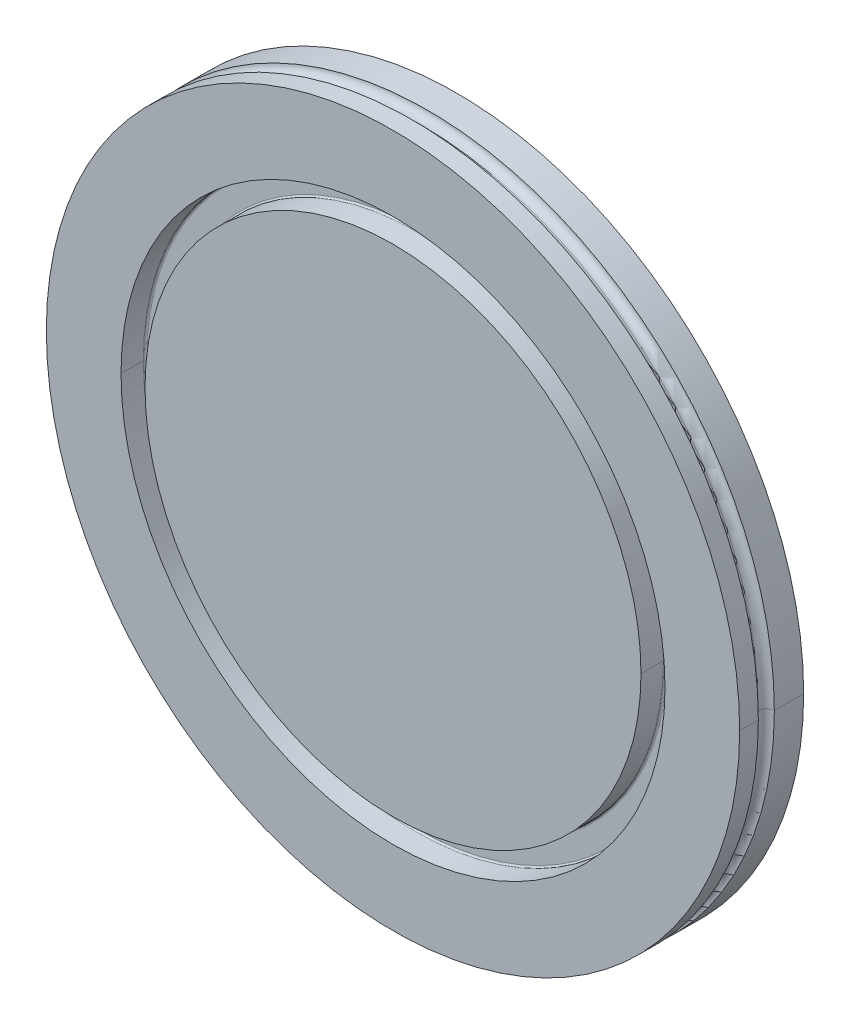
ISO-10303-21;
HEADER;
FILE_DESCRIPTION(('STEP AP214'),'2;1');
FILE_NAME('part.step','',(''),(''),'','','');
FILE_SCHEMA(('AUTOMOTIVE_DESIGN { 1 0 10303 214 1 1 1 1 }'));
ENDSEC;
DATA;
#1=APPLICATION_CONTEXT('core data for automotive mechanical design processes');
#2=APPLICATION_PROTOCOL_DEFINITION('international standard','automotive_design',2000,#1);
#3=PRODUCT_CONTEXT('',#1,'mechanical');
#4=PRODUCT('Part','Part','',(#3));
#5=PRODUCT_RELATED_PRODUCT_CATEGORY('part','',(#4));
#6=PRODUCT_DEFINITION_FORMATION('','',#4);
#7=PRODUCT_DEFINITION_CONTEXT('part definition',#1,'design');
#8=PRODUCT_DEFINITION('design','',#6,#7);
#9=PRODUCT_DEFINITION_SHAPE('','',#8);
#10=(LENGTH_UNIT() NAMED_UNIT(*) SI_UNIT(.MILLI.,.METRE.));
#11=(NAMED_UNIT(*) PLANE_ANGLE_UNIT() SI_UNIT($,.RADIAN.));
#12=(NAMED_UNIT(*) SI_UNIT($,.STERADIAN.) SOLID_ANGLE_UNIT());
#13=UNCERTAINTY_MEASURE_WITH_UNIT(LENGTH_MEASURE(1.E-05),#10,'distance_accuracy_value','');
#14=(GEOMETRIC_REPRESENTATION_CONTEXT(3) GLOBAL_UNCERTAINTY_ASSIGNED_CONTEXT((#13)) GLOBAL_UNIT_ASSIGNED_CONTEXT((#10,
#11,#12)) REPRESENTATION_CONTEXT('',''));
#15=CARTESIAN_POINT('',(0.,0.,0.));
#16=DIRECTION('',(0.,0.,1.));
#17=DIRECTION('',(1.,0.,0.));
#18=AXIS2_PLACEMENT_3D('',#15,#16,#17);
#19=CARTESIAN_POINT('',(0.,0.,0.));
#20=DIRECTION('',(0.,0.,-1.));
#21=DIRECTION('',(0.,-1.,0.));
#22=AXIS2_PLACEMENT_3D('',#19,#20,#21);
#23=PLANE('',#22);
#24=CARTESIAN_POINT('',(0.,0.,0.));
#25=DIRECTION('',(0.,0.,1.));
#26=DIRECTION('',(1.,0.,0.));
#27=AXIS2_PLACEMENT_3D('',#24,#25,#26);
#28=CIRCLE('',#27,46.5);
#29=CARTESIAN_POINT('',(46.5,0.,0.));
#30=VERTEX_POINT('',#29);
#31=CARTESIAN_POINT('',(-46.5,0.,0.));
#32=VERTEX_POINT('',#31);
#33=EDGE_CURVE('E212',#30,#32,#28,.T.);
#34=ORIENTED_EDGE('',*,*,#33,.T.);
#35=CARTESIAN_POINT('',(0.,0.,0.));
#36=DIRECTION('',(0.,0.,1.));
#37=DIRECTION('',(1.,0.,0.));
#38=AXIS2_PLACEMENT_3D('',#35,#36,#37);
#39=CIRCLE('',#38,46.5);
#40=EDGE_CURVE('E11',#32,#30,#39,.T.);
#41=ORIENTED_EDGE('',*,*,#40,.T.);
#42=EDGE_LOOP('',(#34,#41));
#43=FACE_BOUND('',#42,.T.);
#44=ADVANCED_FACE('F17',(#43),#23,.F.);
#45=CARTESIAN_POINT('',(0.,0.,0.));
#46=DIRECTION('',(0.,0.,1.));
#47=DIRECTION('',(1.,0.,0.));
#48=AXIS2_PLACEMENT_3D('',#45,#46,#47);
#49=CYLINDRICAL_SURFACE('',#48,46.5);
#50=DIRECTION('',(0.,0.,1.));
#51=VECTOR('',#50,1.);
#52=CARTESIAN_POINT('',(-46.5,0.,0.));
#53=LINE('',#52,#51);
#54=CARTESIAN_POINT('',(-46.5,0.,-4.2));
#55=VERTEX_POINT('',#54);
#56=EDGE_CURVE('E210',#55,#32,#53,.T.);
#57=ORIENTED_EDGE('',*,*,#56,.F.);
#58=CARTESIAN_POINT('',(0.,0.,-4.2));
#59=DIRECTION('',(0.,0.,1.));
#60=DIRECTION('',(1.,0.,0.));
#61=AXIS2_PLACEMENT_3D('',#58,#59,#60);
#62=CIRCLE('',#61,46.5);
#63=CARTESIAN_POINT('',(46.5,0.,-4.2));
#64=VERTEX_POINT('',#63);
#65=EDGE_CURVE('E225',#55,#64,#62,.T.);
#66=ORIENTED_EDGE('',*,*,#65,.T.);
#67=DIRECTION('',(0.,0.,1.));
#68=VECTOR('',#67,1.);
#69=CARTESIAN_POINT('',(46.5,0.,0.));
#70=LINE('',#69,#68);
#71=EDGE_CURVE('E215',#64,#30,#70,.T.);
#72=ORIENTED_EDGE('',*,*,#71,.T.);
#73=ORIENTED_EDGE('',*,*,#40,.F.);
#74=EDGE_LOOP('',(#57,#66,#72,#73));
#75=FACE_BOUND('',#74,.T.);
#76=ADVANCED_FACE('F623',(#75),#49,.T.);
#77=CARTESIAN_POINT('',(0.,0.,-4.2));
#78=DIRECTION('',(0.,0.,1.));
#79=DIRECTION('',(1.,0.,0.));
#80=AXIS2_PLACEMENT_3D('',#77,#78,#79);
#81=TOROIDAL_SURFACE('',#80,46.8,0.3);
#82=CARTESIAN_POINT('',(-46.8,0.,-4.2));
#83=DIRECTION('',(0.,1.,0.));
#84=DIRECTION('',(-1.,0.,0.));
#85=AXIS2_PLACEMENT_3D('',#82,#83,#84);
#86=CIRCLE('',#85,0.3);
#87=CARTESIAN_POINT('',(-46.8,0.,-4.5));
#88=VERTEX_POINT('',#87);
#89=EDGE_CURVE('E220',#55,#88,#86,.T.);
#90=ORIENTED_EDGE('',*,*,#89,.F.);
#91=CARTESIAN_POINT('',(0.,0.,-4.2));
#92=DIRECTION('',(0.,0.,1.));
#93=DIRECTION('',(1.,0.,0.));
#94=AXIS2_PLACEMENT_3D('',#91,#92,#93);
#95=CIRCLE('',#94,46.5);
#96=EDGE_CURVE('E185',#64,#55,#95,.T.);
#97=ORIENTED_EDGE('',*,*,#96,.F.);
#98=CARTESIAN_POINT('',(46.8,0.,-4.2));
#99=DIRECTION('',(0.,-1.,0.));
#100=DIRECTION('',(0.,0.,-1.));
#101=AXIS2_PLACEMENT_3D('',#98,#99,#100);
#102=CIRCLE('',#101,0.3);
#103=CARTESIAN_POINT('',(46.8,0.,-4.5));
#104=VERTEX_POINT('',#103);
#105=EDGE_CURVE('E230',#64,#104,#102,.T.);
#106=ORIENTED_EDGE('',*,*,#105,.T.);
#107=CARTESIAN_POINT('',(0.,0.,-4.5));
#108=DIRECTION('',(0.,0.,1.));
#109=DIRECTION('',(1.,0.,0.));
#110=AXIS2_PLACEMENT_3D('',#107,#108,#109);
#111=CIRCLE('',#110,46.8);
#112=EDGE_CURVE('E28',#104,#88,#111,.T.);
#113=ORIENTED_EDGE('',*,*,#112,.T.);
#114=EDGE_LOOP('',(#90,#97,#106,#113));
#115=FACE_BOUND('',#114,.T.);
#116=ADVANCED_FACE('F627',(#115),#81,.F.);
#117=CARTESIAN_POINT('',(0.,50.7,-4.5));
#118=DIRECTION('',(0.,0.,-1.));
#119=DIRECTION('',(0.,-1.,0.));
#120=AXIS2_PLACEMENT_3D('',#117,#118,#119);
#121=PLANE('',#120);
#122=ORIENTED_EDGE('',*,*,#112,.F.);
#123=CARTESIAN_POINT('',(0.,0.,-4.5));
#124=DIRECTION('',(0.,0.,1.));
#125=DIRECTION('',(1.,0.,0.));
#126=AXIS2_PLACEMENT_3D('',#123,#124,#125);
#127=CIRCLE('',#126,46.8);
#128=EDGE_CURVE('E224',#88,#104,#127,.T.);
#129=ORIENTED_EDGE('',*,*,#128,.F.);
#130=EDGE_LOOP('',(#122,#129));
#131=FACE_BOUND('',#130,.T.);
#132=CARTESIAN_POINT('',(0.,0.,-4.5));
#133=DIRECTION('',(0.,0.,1.));
#134=DIRECTION('',(1.,0.,0.));
#135=AXIS2_PLACEMENT_3D('',#132,#133,#134);
#136=CIRCLE('',#135,50.7);
#137=CARTESIAN_POINT('',(50.7,0.,-4.5));
#138=VERTEX_POINT('',#137);
#139=CARTESIAN_POINT('',(-50.7,0.,-4.5));
#140=VERTEX_POINT('',#139);
#141=EDGE_CURVE('E112',#138,#140,#136,.T.);
#142=ORIENTED_EDGE('',*,*,#141,.T.);
#143=CARTESIAN_POINT('',(0.,0.,-4.5));
#144=DIRECTION('',(0.,0.,1.));
#145=DIRECTION('',(1.,0.,0.));
#146=AXIS2_PLACEMENT_3D('',#143,#144,#145);
#147=CIRCLE('',#146,50.7);
#148=EDGE_CURVE('E226',#140,#138,#147,.T.);
#149=ORIENTED_EDGE('',*,*,#148,.T.);
#150=EDGE_LOOP('',(#142,#149));
#151=FACE_BOUND('',#150,.T.);
#152=ADVANCED_FACE('F644',(#131,#151),#121,.F.);
#153=CARTESIAN_POINT('',(0.,0.,-4.2));
#154=DIRECTION('',(0.,0.,1.));
#155=DIRECTION('',(1.,0.,0.));
#156=AXIS2_PLACEMENT_3D('',#153,#154,#155);
#157=TOROIDAL_SURFACE('',#156,50.7,0.3);
#158=CARTESIAN_POINT('',(-50.7,0.,-4.2));
#159=DIRECTION('',(0.,1.,0.));
#160=DIRECTION('',(-1.,0.,0.));
#161=AXIS2_PLACEMENT_3D('',#158,#159,#160);
#162=CIRCLE('',#161,0.3);
#163=CARTESIAN_POINT('',(-51.,0.,-4.2));
#164=VERTEX_POINT('',#163);
#165=EDGE_CURVE('E229',#140,#164,#162,.T.);
#166=ORIENTED_EDGE('',*,*,#165,.F.);
#167=ORIENTED_EDGE('',*,*,#141,.F.);
#168=CARTESIAN_POINT('',(50.7,0.,-4.2));
#169=DIRECTION('',(0.,-1.,0.));
#170=DIRECTION('',(0.,0.,-1.));
#171=AXIS2_PLACEMENT_3D('',#168,#169,#170);
#172=CIRCLE('',#171,0.3);
#173=CARTESIAN_POINT('',(51.,0.,-4.2));
#174=VERTEX_POINT('',#173);
#175=EDGE_CURVE('E254',#138,#174,#172,.T.);
#176=ORIENTED_EDGE('',*,*,#175,.T.);
#177=CARTESIAN_POINT('',(0.,0.,-4.2));
#178=DIRECTION('',(0.,0.,1.));
#179=DIRECTION('',(1.,0.,0.));
#180=AXIS2_PLACEMENT_3D('',#177,#178,#179);
#181=CIRCLE('',#180,51.);
#182=EDGE_CURVE('E267',#174,#164,#181,.T.);
#183=ORIENTED_EDGE('',*,*,#182,.T.);
#184=EDGE_LOOP('',(#166,#167,#176,#183));
#185=FACE_BOUND('',#184,.T.);
#186=ADVANCED_FACE('F586',(#185),#157,.F.);
#187=CARTESIAN_POINT('',(0.,0.,0.));
#188=DIRECTION('',(0.,0.,1.));
#189=DIRECTION('',(1.,0.,0.));
#190=AXIS2_PLACEMENT_3D('',#187,#188,#189);
#191=CYLINDRICAL_SURFACE('',#190,51.);
#192=DIRECTION('',(0.,0.,1.));
#193=VECTOR('',#192,1.);
#194=CARTESIAN_POINT('',(-51.,0.,0.));
#195=LINE('',#194,#193);
#196=CARTESIAN_POINT('',(-51.,0.,0.));
#197=VERTEX_POINT('',#196);
#198=EDGE_CURVE('E235',#164,#197,#195,.T.);
#199=ORIENTED_EDGE('',*,*,#198,.F.);
#200=ORIENTED_EDGE('',*,*,#182,.F.);
#201=DIRECTION('',(0.,0.,1.));
#202=VECTOR('',#201,1.);
#203=CARTESIAN_POINT('',(51.,0.,0.));
#204=LINE('',#203,#202);
#205=CARTESIAN_POINT('',(51.,0.,0.));
#206=VERTEX_POINT('',#205);
#207=EDGE_CURVE('E21',#174,#206,#204,.T.);
#208=ORIENTED_EDGE('',*,*,#207,.T.);
#209=CARTESIAN_POINT('',(0.,0.,0.));
#210=DIRECTION('',(0.,0.,1.));
#211=DIRECTION('',(1.,0.,0.));
#212=AXIS2_PLACEMENT_3D('',#209,#210,#211);
#213=CIRCLE('',#212,51.);
#214=EDGE_CURVE('E265',#206,#197,#213,.T.);
#215=ORIENTED_EDGE('',*,*,#214,.T.);
#216=EDGE_LOOP('',(#199,#200,#208,#215));
#217=FACE_BOUND('',#216,.T.);
#218=ADVANCED_FACE('F581',(#217),#191,.F.);
#219=CARTESIAN_POINT('',(0.,51.,0.));
#220=DIRECTION('',(0.,0.,-1.));
#221=DIRECTION('',(0.,-1.,0.));
#222=AXIS2_PLACEMENT_3D('',#219,#220,#221);
#223=PLANE('',#222);
#224=ORIENTED_EDGE('',*,*,#214,.F.);
#225=CARTESIAN_POINT('',(0.,0.,0.));
#226=DIRECTION('',(0.,0.,1.));
#227=DIRECTION('',(1.,0.,0.));
#228=AXIS2_PLACEMENT_3D('',#225,#226,#227);
#229=CIRCLE('',#228,51.);
#230=EDGE_CURVE('E231',#197,#206,#229,.T.);
#231=ORIENTED_EDGE('',*,*,#230,.F.);
#232=EDGE_LOOP('',(#224,#231));
#233=FACE_BOUND('',#232,.T.);
#234=CARTESIAN_POINT('',(0.,0.,0.));
#235=DIRECTION('',(0.,0.,1.));
#236=DIRECTION('',(1.,0.,0.));
#237=AXIS2_PLACEMENT_3D('',#234,#235,#236);
#238=CIRCLE('',#237,65.);
#239=CARTESIAN_POINT('',(65.,0.,0.));
#240=VERTEX_POINT('',#239);
#241=CARTESIAN_POINT('',(-65.,0.,0.));
#242=VERTEX_POINT('',#241);
#243=EDGE_CURVE('E172',#240,#242,#238,.T.);
#244=ORIENTED_EDGE('',*,*,#243,.T.);
#245=CARTESIAN_POINT('',(0.,0.,0.));
#246=DIRECTION('',(0.,0.,1.));
#247=DIRECTION('',(1.,0.,0.));
#248=AXIS2_PLACEMENT_3D('',#245,#246,#247);
#249=CIRCLE('',#248,65.);
#250=EDGE_CURVE('E268',#242,#240,#249,.T.);
#251=ORIENTED_EDGE('',*,*,#250,.T.);
#252=EDGE_LOOP('',(#244,#251));
#253=FACE_BOUND('',#252,.T.);
#254=ADVANCED_FACE('F585',(#233,#253),#223,.F.);
#255=CARTESIAN_POINT('',(0.,0.,0.));
#256=DIRECTION('',(0.,0.,1.));
#257=DIRECTION('',(1.,0.,0.));
#258=AXIS2_PLACEMENT_3D('',#255,#256,#257);
#259=CYLINDRICAL_SURFACE('',#258,65.);
#260=DIRECTION('',(0.,0.,1.));
#261=VECTOR('',#260,1.);
#262=CARTESIAN_POINT('',(-65.,0.,0.));
#263=LINE('',#262,#261);
#264=CARTESIAN_POINT('',(-65.,0.,-3.5));
#265=VERTEX_POINT('',#264);
#266=EDGE_CURVE('E180',#265,#242,#263,.T.);
#267=ORIENTED_EDGE('',*,*,#266,.F.);
#268=CARTESIAN_POINT('',(0.,0.,-3.5));
#269=DIRECTION('',(0.,0.,1.));
#270=DIRECTION('',(1.,0.,0.));
#271=AXIS2_PLACEMENT_3D('',#268,#269,#270);
#272=CIRCLE('',#271,65.);
#273=CARTESIAN_POINT('',(65.,0.,-3.5));
#274=VERTEX_POINT('',#273);
#275=EDGE_CURVE('E178',#265,#274,#272,.T.);
#276=ORIENTED_EDGE('',*,*,#275,.T.);
#277=DIRECTION('',(0.,0.,1.));
#278=VECTOR('',#277,1.);
#279=CARTESIAN_POINT('',(65.,0.,0.));
#280=LINE('',#279,#278);
#281=EDGE_CURVE('E164',#274,#240,#280,.T.);
#282=ORIENTED_EDGE('',*,*,#281,.T.);
#283=ORIENTED_EDGE('',*,*,#250,.F.);
#284=EDGE_LOOP('',(#267,#276,#282,#283));
#285=FACE_BOUND('',#284,.T.);
#286=ADVANCED_FACE('F179',(#285),#259,.T.);
#287=CARTESIAN_POINT('',(0.,0.,-5.));
#288=DIRECTION('',(0.,0.,1.));
#289=DIRECTION('',(1.,0.,0.));
#290=AXIS2_PLACEMENT_3D('',#287,#288,#289);
#291=TOROIDAL_SURFACE('',#290,65.,1.5);
#292=CARTESIAN_POINT('',(0.,0.,-5.));
#293=DIRECTION('',(0.,0.,1.));
#294=DIRECTION('',(1.,0.,0.));
#295=AXIS2_PLACEMENT_3D('',#292,#293,#294);
#296=CIRCLE('',#295,63.5);
#297=CARTESIAN_POINT('',(63.5,0.,-5.));
#298=VERTEX_POINT('',#297);
#299=CARTESIAN_POINT('',(-63.5,0.,-5.));
#300=VERTEX_POINT('',#299);
#301=EDGE_CURVE('E201',#298,#300,#296,.T.);
#302=ORIENTED_EDGE('',*,*,#301,.F.);
#303=CARTESIAN_POINT('',(65.,0.,-5.));
#304=DIRECTION('',(0.,-1.,0.));
#305=DIRECTION('',(0.,0.,-1.));
#306=AXIS2_PLACEMENT_3D('',#303,#304,#305);
#307=CIRCLE('',#306,1.5);
#308=CARTESIAN_POINT('',(65.,0.,-6.5));
#309=VERTEX_POINT('',#308);
#310=EDGE_CURVE('E240',#298,#309,#307,.T.);
#311=ORIENTED_EDGE('',*,*,#310,.T.);
#312=CARTESIAN_POINT('',(0.,0.,-6.5));
#313=DIRECTION('',(0.,0.,1.));
#314=DIRECTION('',(1.,0.,0.));
#315=AXIS2_PLACEMENT_3D('',#312,#313,#314);
#316=CIRCLE('',#315,65.);
#317=CARTESIAN_POINT('',(-65.,0.,-6.5));
#318=VERTEX_POINT('',#317);
#319=EDGE_CURVE('E250',#309,#318,#316,.T.);
#320=ORIENTED_EDGE('',*,*,#319,.T.);
#321=CARTESIAN_POINT('',(-65.,0.,-5.));
#322=DIRECTION('',(0.,1.,0.));
#323=DIRECTION('',(-1.,0.,0.));
#324=AXIS2_PLACEMENT_3D('',#321,#322,#323);
#325=CIRCLE('',#324,1.5);
#326=EDGE_CURVE('E175',#300,#318,#325,.T.);
#327=ORIENTED_EDGE('',*,*,#326,.F.);
#328=EDGE_LOOP('',(#302,#311,#320,#327));
#329=FACE_BOUND('',#328,.T.);
#330=ADVANCED_FACE('F561',(#329),#291,.F.);
#331=CARTESIAN_POINT('',(0.,0.,0.));
#332=DIRECTION('',(0.,0.,1.));
#333=DIRECTION('',(1.,0.,0.));
#334=AXIS2_PLACEMENT_3D('',#331,#332,#333);
#335=CYLINDRICAL_SURFACE('',#334,65.);
#336=DIRECTION('',(0.,0.,1.));
#337=VECTOR('',#336,1.);
#338=CARTESIAN_POINT('',(-65.,0.,0.));
#339=LINE('',#338,#337);
#340=CARTESIAN_POINT('',(-65.,0.,-12.));
#341=VERTEX_POINT('',#340);
#342=EDGE_CURVE('E246',#341,#318,#339,.T.);
#343=ORIENTED_EDGE('',*,*,#342,.F.);
#344=CARTESIAN_POINT('',(0.,0.,-12.));
#345=DIRECTION('',(0.,0.,1.));
#346=DIRECTION('',(1.,0.,0.));
#347=AXIS2_PLACEMENT_3D('',#344,#345,#346);
#348=CIRCLE('',#347,65.);
#349=CARTESIAN_POINT('',(65.,0.,-12.));
#350=VERTEX_POINT('',#349);
#351=EDGE_CURVE('E263',#341,#350,#348,.T.);
#352=ORIENTED_EDGE('',*,*,#351,.T.);
#353=DIRECTION('',(0.,0.,1.));
#354=VECTOR('',#353,1.);
#355=CARTESIAN_POINT('',(65.,0.,0.));
#356=LINE('',#355,#354);
#357=EDGE_CURVE('E279',#350,#309,#356,.T.);
#358=ORIENTED_EDGE('',*,*,#357,.T.);
#359=CARTESIAN_POINT('',(0.,0.,-6.5));
#360=DIRECTION('',(0.,0.,1.));
#361=DIRECTION('',(1.,0.,0.));
#362=AXIS2_PLACEMENT_3D('',#359,#360,#361);
#363=CIRCLE('',#362,65.);
#364=EDGE_CURVE('E245',#318,#309,#363,.T.);
#365=ORIENTED_EDGE('',*,*,#364,.F.);
#366=EDGE_LOOP('',(#343,#352,#358,#365));
#367=FACE_BOUND('',#366,.T.);
#368=ADVANCED_FACE('F362',(#367),#335,.T.);
#369=CARTESIAN_POINT('',(0.,65.,-12.));
#370=DIRECTION('',(0.,0.,1.));
#371=DIRECTION('',(1.,0.,0.));
#372=AXIS2_PLACEMENT_3D('',#369,#370,#371);
#373=PLANE('',#372);
#374=CARTESIAN_POINT('',(0.,0.,-12.));
#375=DIRECTION('',(0.,0.,1.));
#376=DIRECTION('',(1.,0.,0.));
#377=AXIS2_PLACEMENT_3D('',#374,#375,#376);
#378=CIRCLE('',#377,62.5);
#379=CARTESIAN_POINT('',(62.5,0.,-12.));
#380=VERTEX_POINT('',#379);
#381=CARTESIAN_POINT('',(-62.5,0.,-12.));
#382=VERTEX_POINT('',#381);
#383=EDGE_CURVE('E260',#380,#382,#378,.T.);
#384=ORIENTED_EDGE('',*,*,#383,.T.);
#385=CARTESIAN_POINT('',(0.,0.,-12.));
#386=DIRECTION('',(0.,0.,1.));
#387=DIRECTION('',(1.,0.,0.));
#388=AXIS2_PLACEMENT_3D('',#385,#386,#387);
#389=CIRCLE('',#388,62.5);
#390=EDGE_CURVE('E274',#382,#380,#389,.T.);
#391=ORIENTED_EDGE('',*,*,#390,.T.);
#392=EDGE_LOOP('',(#384,#391));
#393=FACE_BOUND('',#392,.T.);
#394=CARTESIAN_POINT('',(0.,0.,-12.));
#395=DIRECTION('',(0.,0.,1.));
#396=DIRECTION('',(1.,0.,0.));
#397=AXIS2_PLACEMENT_3D('',#394,#395,#396);
#398=CIRCLE('',#397,65.);
#399=EDGE_CURVE('E244',#350,#341,#398,.T.);
#400=ORIENTED_EDGE('',*,*,#399,.F.);
#401=ORIENTED_EDGE('',*,*,#351,.F.);
#402=EDGE_LOOP('',(#400,#401));
#403=FACE_BOUND('',#402,.T.);
#404=ADVANCED_FACE('F359',(#393,#403),#373,.F.);
#405=CARTESIAN_POINT('',(0.,0.,0.));
#406=DIRECTION('',(0.,0.,1.));
#407=DIRECTION('',(1.,0.,0.));
#408=AXIS2_PLACEMENT_3D('',#405,#406,#407);
#409=CYLINDRICAL_SURFACE('',#408,62.5);
#410=DIRECTION('',(0.,0.,1.));
#411=VECTOR('',#410,1.);
#412=CARTESIAN_POINT('',(-62.5,0.,0.));
#413=LINE('',#412,#411);
#414=CARTESIAN_POINT('',(-62.5,0.,-10.5));
#415=VERTEX_POINT('',#414);
#416=EDGE_CURVE('E278',#382,#415,#413,.T.);
#417=ORIENTED_EDGE('',*,*,#416,.F.);
#418=ORIENTED_EDGE('',*,*,#383,.F.);
#419=DIRECTION('',(0.,0.,1.));
#420=VECTOR('',#419,1.);
#421=CARTESIAN_POINT('',(62.5,0.,0.));
#422=LINE('',#421,#420);
#423=CARTESIAN_POINT('',(62.5,0.,-10.5));
#424=VERTEX_POINT('',#423);
#425=EDGE_CURVE('E282',#380,#424,#422,.T.);
#426=ORIENTED_EDGE('',*,*,#425,.T.);
#427=CARTESIAN_POINT('',(0.,0.,-10.5));
#428=DIRECTION('',(0.,0.,1.));
#429=DIRECTION('',(1.,0.,0.));
#430=AXIS2_PLACEMENT_3D('',#427,#428,#429);
#431=CIRCLE('',#430,62.5);
#432=EDGE_CURVE('E264',#424,#415,#431,.T.);
#433=ORIENTED_EDGE('',*,*,#432,.T.);
#434=EDGE_LOOP('',(#417,#418,#426,#433));
#435=FACE_BOUND('',#434,.T.);
#436=ADVANCED_FACE('F349',(#435),#409,.F.);
#437=CARTESIAN_POINT('',(0.,62.5,-10.5));
#438=DIRECTION('',(0.,0.,1.));
#439=DIRECTION('',(1.,0.,0.));
#440=AXIS2_PLACEMENT_3D('',#437,#438,#439);
#441=PLANE('',#440);
#442=CARTESIAN_POINT('',(0.,0.,-10.5));
#443=DIRECTION('',(0.,0.,1.));
#444=DIRECTION('',(1.,0.,0.));
#445=AXIS2_PLACEMENT_3D('',#442,#443,#444);
#446=CIRCLE('',#445,55.);
#447=CARTESIAN_POINT('',(55.,0.,-10.5));
#448=VERTEX_POINT('',#447);
#449=CARTESIAN_POINT('',(-55.,0.,-10.5));
#450=VERTEX_POINT('',#449);
#451=EDGE_CURVE('E259',#448,#450,#446,.T.);
#452=ORIENTED_EDGE('',*,*,#451,.T.);
#453=CARTESIAN_POINT('',(0.,0.,-10.5));
#454=DIRECTION('',(0.,0.,1.));
#455=DIRECTION('',(1.,0.,0.));
#456=AXIS2_PLACEMENT_3D('',#453,#454,#455);
#457=CIRCLE('',#456,55.);
#458=EDGE_CURVE('E41',#450,#448,#457,.T.);
#459=ORIENTED_EDGE('',*,*,#458,.T.);
#460=EDGE_LOOP('',(#452,#459));
#461=FACE_BOUND('',#460,.T.);
#462=ORIENTED_EDGE('',*,*,#432,.F.);
#463=CARTESIAN_POINT('',(0.,0.,-10.5));
#464=DIRECTION('',(0.,0.,1.));
#465=DIRECTION('',(1.,0.,0.));
#466=AXIS2_PLACEMENT_3D('',#463,#464,#465);
#467=CIRCLE('',#466,62.5);
#468=EDGE_CURVE('E287',#415,#424,#467,.T.);
#469=ORIENTED_EDGE('',*,*,#468,.F.);
#470=EDGE_LOOP('',(#462,#469));
#471=FACE_BOUND('',#470,.T.);
#472=ADVANCED_FACE('F346',(#461,#471),#441,.F.);
#473=CARTESIAN_POINT('',(0.,0.,0.));
#474=DIRECTION('',(0.,0.,1.));
#475=DIRECTION('',(1.,0.,0.));
#476=AXIS2_PLACEMENT_3D('',#473,#474,#475);
#477=CYLINDRICAL_SURFACE('',#476,55.);
#478=DIRECTION('',(0.,0.,1.));
#479=VECTOR('',#478,1.);
#480=CARTESIAN_POINT('',(-55.,0.,0.));
#481=LINE('',#480,#479);
#482=CARTESIAN_POINT('',(-55.,0.,-12.));
#483=VERTEX_POINT('',#482);
#484=EDGE_CURVE('E291',#483,#450,#481,.T.);
#485=ORIENTED_EDGE('',*,*,#484,.F.);
#486=CARTESIAN_POINT('',(0.,0.,-12.));
#487=DIRECTION('',(0.,0.,1.));
#488=DIRECTION('',(1.,0.,0.));
#489=AXIS2_PLACEMENT_3D('',#486,#487,#488);
#490=CIRCLE('',#489,55.);
#491=CARTESIAN_POINT('',(55.,0.,-12.));
#492=VERTEX_POINT('',#491);
#493=EDGE_CURVE('E258',#483,#492,#490,.T.);
#494=ORIENTED_EDGE('',*,*,#493,.T.);
#495=DIRECTION('',(0.,0.,1.));
#496=VECTOR('',#495,1.);
#497=CARTESIAN_POINT('',(55.,0.,0.));
#498=LINE('',#497,#496);
#499=EDGE_CURVE('E255',#492,#448,#498,.T.);
#500=ORIENTED_EDGE('',*,*,#499,.T.);
#501=ORIENTED_EDGE('',*,*,#458,.F.);
#502=EDGE_LOOP('',(#485,#494,#500,#501));
#503=FACE_BOUND('',#502,.T.);
#504=ADVANCED_FACE('F343',(#503),#477,.T.);
#505=CARTESIAN_POINT('',(0.,55.,-12.));
#506=DIRECTION('',(0.,0.,1.));
#507=DIRECTION('',(1.,0.,0.));
#508=AXIS2_PLACEMENT_3D('',#505,#506,#507);
#509=PLANE('',#508);
#510=CARTESIAN_POINT('',(0.,0.,-12.));
#511=DIRECTION('',(0.,0.,1.));
#512=DIRECTION('',(1.,0.,0.));
#513=AXIS2_PLACEMENT_3D('',#510,#511,#512);
#514=CIRCLE('',#513,55.);
#515=EDGE_CURVE('E286',#492,#483,#514,.T.);
#516=ORIENTED_EDGE('',*,*,#515,.F.);
#517=ORIENTED_EDGE('',*,*,#493,.F.);
#518=EDGE_LOOP('',(#516,#517));
#519=FACE_BOUND('',#518,.T.);
#520=ADVANCED_FACE('F19',(#519),#509,.F.);
#521=CARTESIAN_POINT('',(0.,0.,0.));
#522=DIRECTION('',(0.,0.,1.));
#523=DIRECTION('',(1.,0.,0.));
#524=AXIS2_PLACEMENT_3D('',#521,#522,#523);
#525=CYLINDRICAL_SURFACE('',#524,55.);
#526=ORIENTED_EDGE('',*,*,#515,.T.);
#527=ORIENTED_EDGE('',*,*,#484,.T.);
#528=ORIENTED_EDGE('',*,*,#451,.F.);
#529=ORIENTED_EDGE('',*,*,#499,.F.);
#530=EDGE_LOOP('',(#526,#527,#528,#529));
#531=FACE_BOUND('',#530,.T.);
#532=ADVANCED_FACE('F339',(#531),#525,.T.);
#533=CARTESIAN_POINT('',(0.,0.,0.));
#534=DIRECTION('',(0.,0.,1.));
#535=DIRECTION('',(1.,0.,0.));
#536=AXIS2_PLACEMENT_3D('',#533,#534,#535);
#537=CYLINDRICAL_SURFACE('',#536,62.5);
#538=ORIENTED_EDGE('',*,*,#390,.F.);
#539=ORIENTED_EDGE('',*,*,#416,.T.);
#540=ORIENTED_EDGE('',*,*,#468,.T.);
#541=ORIENTED_EDGE('',*,*,#425,.F.);
#542=EDGE_LOOP('',(#538,#539,#540,#541));
#543=FACE_BOUND('',#542,.T.);
#544=ADVANCED_FACE('F357',(#543),#537,.F.);
#545=CARTESIAN_POINT('',(0.,0.,0.));
#546=DIRECTION('',(0.,0.,1.));
#547=DIRECTION('',(1.,0.,0.));
#548=AXIS2_PLACEMENT_3D('',#545,#546,#547);
#549=CYLINDRICAL_SURFACE('',#548,65.);
#550=ORIENTED_EDGE('',*,*,#399,.T.);
#551=ORIENTED_EDGE('',*,*,#342,.T.);
#552=ORIENTED_EDGE('',*,*,#319,.F.);
#553=ORIENTED_EDGE('',*,*,#357,.F.);
#554=EDGE_LOOP('',(#550,#551,#552,#553));
#555=FACE_BOUND('',#554,.T.);
#556=ADVANCED_FACE('F369',(#555),#549,.T.);
#557=CARTESIAN_POINT('',(0.,0.,-5.));
#558=DIRECTION('',(0.,0.,1.));
#559=DIRECTION('',(1.,0.,0.));
#560=AXIS2_PLACEMENT_3D('',#557,#558,#559);
#561=TOROIDAL_SURFACE('',#560,65.,1.5);
#562=CARTESIAN_POINT('',(0.,0.,-5.));
#563=DIRECTION('',(0.,0.,1.));
#564=DIRECTION('',(1.,0.,0.));
#565=AXIS2_PLACEMENT_3D('',#562,#563,#564);
#566=CIRCLE('',#565,63.5);
#567=EDGE_CURVE('E186',#300,#298,#566,.T.);
#568=ORIENTED_EDGE('',*,*,#567,.F.);
#569=ORIENTED_EDGE('',*,*,#326,.T.);
#570=ORIENTED_EDGE('',*,*,#364,.T.);
#571=ORIENTED_EDGE('',*,*,#310,.F.);
#572=EDGE_LOOP('',(#568,#569,#570,#571));
#573=FACE_BOUND('',#572,.T.);
#574=ADVANCED_FACE('F533',(#573),#561,.F.);
#575=CARTESIAN_POINT('',(0.,0.,0.));
#576=DIRECTION('',(0.,0.,1.));
#577=DIRECTION('',(1.,0.,0.));
#578=AXIS2_PLACEMENT_3D('',#575,#576,#577);
#579=CYLINDRICAL_SURFACE('',#578,65.);
#580=CARTESIAN_POINT('',(0.,0.,-3.5));
#581=DIRECTION('',(0.,0.,1.));
#582=DIRECTION('',(1.,0.,0.));
#583=AXIS2_PLACEMENT_3D('',#580,#581,#582);
#584=CIRCLE('',#583,65.);
#585=EDGE_CURVE('E169',#274,#265,#584,.T.);
#586=ORIENTED_EDGE('',*,*,#585,.T.);
#587=ORIENTED_EDGE('',*,*,#266,.T.);
#588=ORIENTED_EDGE('',*,*,#243,.F.);
#589=ORIENTED_EDGE('',*,*,#281,.F.);
#590=EDGE_LOOP('',(#586,#587,#588,#589));
#591=FACE_BOUND('',#590,.T.);
#592=ADVANCED_FACE('F166',(#591),#579,.T.);
#593=CARTESIAN_POINT('',(0.,0.,0.));
#594=DIRECTION('',(0.,0.,1.));
#595=DIRECTION('',(1.,0.,0.));
#596=AXIS2_PLACEMENT_3D('',#593,#594,#595);
#597=CYLINDRICAL_SURFACE('',#596,51.);
#598=CARTESIAN_POINT('',(0.,0.,-4.2));
#599=DIRECTION('',(0.,0.,1.));
#600=DIRECTION('',(1.,0.,0.));
#601=AXIS2_PLACEMENT_3D('',#598,#599,#600);
#602=CIRCLE('',#601,51.);
#603=EDGE_CURVE('E239',#164,#174,#602,.T.);
#604=ORIENTED_EDGE('',*,*,#603,.F.);
#605=ORIENTED_EDGE('',*,*,#198,.T.);
#606=ORIENTED_EDGE('',*,*,#230,.T.);
#607=ORIENTED_EDGE('',*,*,#207,.F.);
#608=EDGE_LOOP('',(#604,#605,#606,#607));
#609=FACE_BOUND('',#608,.T.);
#610=ADVANCED_FACE('F544',(#609),#597,.F.);
#611=CARTESIAN_POINT('',(0.,0.,-4.2));
#612=DIRECTION('',(0.,0.,1.));
#613=DIRECTION('',(1.,0.,0.));
#614=AXIS2_PLACEMENT_3D('',#611,#612,#613);
#615=TOROIDAL_SURFACE('',#614,50.7,0.3);
#616=ORIENTED_EDGE('',*,*,#148,.F.);
#617=ORIENTED_EDGE('',*,*,#165,.T.);
#618=ORIENTED_EDGE('',*,*,#603,.T.);
#619=ORIENTED_EDGE('',*,*,#175,.F.);
#620=EDGE_LOOP('',(#616,#617,#618,#619));
#621=FACE_BOUND('',#620,.T.);
#622=ADVANCED_FACE('F539',(#621),#615,.F.);
#623=CARTESIAN_POINT('',(0.,0.,-4.2));
#624=DIRECTION('',(0.,0.,1.));
#625=DIRECTION('',(1.,0.,0.));
#626=AXIS2_PLACEMENT_3D('',#623,#624,#625);
#627=TOROIDAL_SURFACE('',#626,46.8,0.3);
#628=ORIENTED_EDGE('',*,*,#65,.F.);
#629=ORIENTED_EDGE('',*,*,#89,.T.);
#630=ORIENTED_EDGE('',*,*,#128,.T.);
#631=ORIENTED_EDGE('',*,*,#105,.F.);
#632=EDGE_LOOP('',(#628,#629,#630,#631));
#633=FACE_BOUND('',#632,.T.);
#634=ADVANCED_FACE('F543',(#633),#627,.F.);
#635=CARTESIAN_POINT('',(0.,0.,0.));
#636=DIRECTION('',(0.,0.,1.));
#637=DIRECTION('',(1.,0.,0.));
#638=AXIS2_PLACEMENT_3D('',#635,#636,#637);
#639=CYLINDRICAL_SURFACE('',#638,46.5);
#640=ORIENTED_EDGE('',*,*,#96,.T.);
#641=ORIENTED_EDGE('',*,*,#56,.T.);
#642=ORIENTED_EDGE('',*,*,#33,.F.);
#643=ORIENTED_EDGE('',*,*,#71,.F.);
#644=EDGE_LOOP('',(#640,#641,#642,#643));
#645=FACE_BOUND('',#644,.T.);
#646=ADVANCED_FACE('F594',(#645),#639,.T.);
#647=CARTESIAN_POINT('',(0.,0.,-5.));
#648=DIRECTION('',(0.,0.,1.));
#649=DIRECTION('',(1.,0.,0.));
#650=AXIS2_PLACEMENT_3D('',#647,#648,#649);
#651=TOROIDAL_SURFACE('',#650,65.,1.5);
#652=CARTESIAN_POINT('',(-65.,0.,-5.));
#653=DIRECTION('',(0.,1.,0.));
#654=DIRECTION('',(-1.,0.,0.));
#655=AXIS2_PLACEMENT_3D('',#652,#653,#654);
#656=CIRCLE('',#655,1.5);
#657=EDGE_CURVE('E193',#265,#300,#656,.T.);
#658=ORIENTED_EDGE('',*,*,#657,.T.);
#659=ORIENTED_EDGE('',*,*,#567,.T.);
#660=CARTESIAN_POINT('',(65.,0.,-5.));
#661=DIRECTION('',(0.,-1.,0.));
#662=DIRECTION('',(0.,0.,-1.));
#663=AXIS2_PLACEMENT_3D('',#660,#661,#662);
#664=CIRCLE('',#663,1.5);
#665=EDGE_CURVE('E192',#274,#298,#664,.T.);
#666=ORIENTED_EDGE('',*,*,#665,.F.);
#667=ORIENTED_EDGE('',*,*,#275,.F.);
#668=EDGE_LOOP('',(#658,#659,#666,#667));
#669=FACE_BOUND('',#668,.T.);
#670=ADVANCED_FACE('F197',(#669),#651,.F.);
#671=CARTESIAN_POINT('',(0.,0.,-5.));
#672=DIRECTION('',(0.,0.,1.));
#673=DIRECTION('',(1.,0.,0.));
#674=AXIS2_PLACEMENT_3D('',#671,#672,#673);
#675=TOROIDAL_SURFACE('',#674,65.,1.5);
#676=ORIENTED_EDGE('',*,*,#665,.T.);
#677=ORIENTED_EDGE('',*,*,#301,.T.);
#678=ORIENTED_EDGE('',*,*,#657,.F.);
#679=ORIENTED_EDGE('',*,*,#585,.F.);
#680=EDGE_LOOP('',(#676,#677,#678,#679));
#681=FACE_BOUND('',#680,.T.);
#682=ADVANCED_FACE('F190',(#681),#675,.F.);
#683=CLOSED_SHELL('',(#44,#76,#116,#152,#186,#218,#254,#286,#330,#368,#404,#436,#472,#504,#520,
#532,#544,#556,#574,#592,#610,#622,#634,#646,#670,#682));
#684=MANIFOLD_SOLID_BREP('B1',#683);
#685=ADVANCED_BREP_SHAPE_REPRESENTATION('',(#18,#684),#14);
#686=SHAPE_DEFINITION_REPRESENTATION(#9,#685);
ENDSEC;
END-ISO-10303-21;
